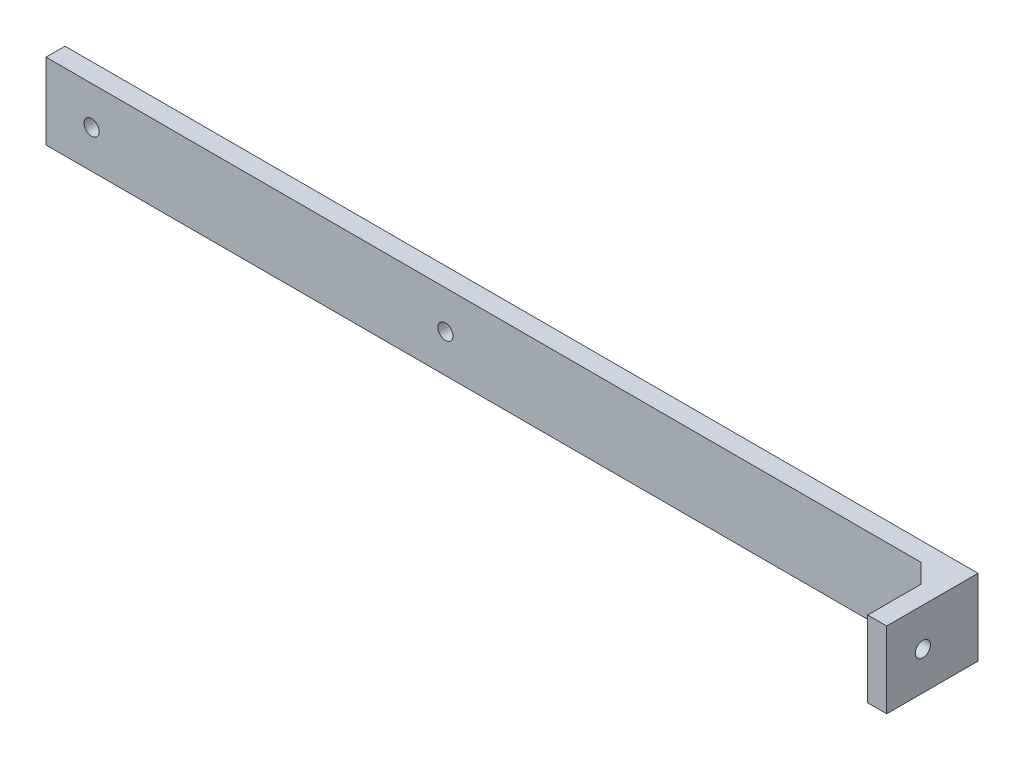
ISO-10303-21;
HEADER;
FILE_DESCRIPTION(('STEP AP214'),'2;1');
FILE_NAME('part.step','',(''),(''),'','','');
FILE_SCHEMA(('AUTOMOTIVE_DESIGN { 1 0 10303 214 1 1 1 1 }'));
ENDSEC;
DATA;
#1=APPLICATION_CONTEXT('core data for automotive mechanical design processes');
#2=APPLICATION_PROTOCOL_DEFINITION('international standard','automotive_design',2000,#1);
#3=PRODUCT_CONTEXT('',#1,'mechanical');
#4=PRODUCT('Part','Part','',(#3));
#5=PRODUCT_RELATED_PRODUCT_CATEGORY('part','',(#4));
#6=PRODUCT_DEFINITION_FORMATION('','',#4);
#7=PRODUCT_DEFINITION_CONTEXT('part definition',#1,'design');
#8=PRODUCT_DEFINITION('design','',#6,#7);
#9=PRODUCT_DEFINITION_SHAPE('','',#8);
#10=(LENGTH_UNIT() NAMED_UNIT(*) SI_UNIT(.MILLI.,.METRE.));
#11=(NAMED_UNIT(*) PLANE_ANGLE_UNIT() SI_UNIT($,.RADIAN.));
#12=(NAMED_UNIT(*) SI_UNIT($,.STERADIAN.) SOLID_ANGLE_UNIT());
#13=UNCERTAINTY_MEASURE_WITH_UNIT(LENGTH_MEASURE(1.E-05),#10,'distance_accuracy_value','');
#14=(GEOMETRIC_REPRESENTATION_CONTEXT(3) GLOBAL_UNCERTAINTY_ASSIGNED_CONTEXT((#13)) GLOBAL_UNIT_ASSIGNED_CONTEXT((#10,
#11,#12)) REPRESENTATION_CONTEXT('',''));
#15=CARTESIAN_POINT('',(0.,0.,0.));
#16=DIRECTION('',(0.,0.,1.));
#17=DIRECTION('',(1.,0.,0.));
#18=AXIS2_PLACEMENT_3D('',#15,#16,#17);
#19=CARTESIAN_POINT('',(0.,0.,5.));
#20=DIRECTION('',(0.,0.,-1.));
#21=DIRECTION('',(-1.,0.,0.));
#22=AXIS2_PLACEMENT_3D('',#19,#20,#21);
#23=PLANE('',#22);
#24=CARTESIAN_POINT('',(-15.,0.,5.));
#25=DIRECTION('',(0.,0.,-1.));
#26=DIRECTION('',(-1.,0.,0.));
#27=AXIS2_PLACEMENT_3D('',#24,#25,#26);
#28=CIRCLE('',#27,2.);
#29=CARTESIAN_POINT('',(-17.,0.,5.));
#30=VERTEX_POINT('',#29);
#31=EDGE_CURVE('E376',#30,#30,#28,.T.);
#32=ORIENTED_EDGE('',*,*,#31,.T.);
#33=EDGE_LOOP('',(#32));
#34=FACE_BOUND('',#33,.T.);
#35=CARTESIAN_POINT('',(-108.,0.,5.));
#36=DIRECTION('',(0.,0.,-1.));
#37=DIRECTION('',(-1.,0.,0.));
#38=AXIS2_PLACEMENT_3D('',#35,#36,#37);
#39=CIRCLE('',#38,2.);
#40=CARTESIAN_POINT('',(-110.,0.,5.));
#41=VERTEX_POINT('',#40);
#42=EDGE_CURVE('E380',#41,#41,#39,.T.);
#43=ORIENTED_EDGE('',*,*,#42,.T.);
#44=EDGE_LOOP('',(#43));
#45=FACE_BOUND('',#44,.T.);
#46=DIRECTION('',(1.,0.,0.));
#47=VECTOR('',#46,1.);
#48=CARTESIAN_POINT('',(110.,5.,5.));
#49=LINE('',#48,#47);
#50=CARTESIAN_POINT('',(110.,5.,5.));
#51=VERTEX_POINT('',#50);
#52=CARTESIAN_POINT('',(115.,5.,5.));
#53=VERTEX_POINT('',#52);
#54=EDGE_CURVE('E200',#51,#53,#49,.T.);
#55=ORIENTED_EDGE('',*,*,#54,.F.);
#56=DIRECTION('',(0.,-1.,0.));
#57=VECTOR('',#56,1.);
#58=CARTESIAN_POINT('',(110.,10.,5.));
#59=LINE('',#58,#57);
#60=CARTESIAN_POINT('',(110.,10.,5.));
#61=VERTEX_POINT('',#60);
#62=EDGE_CURVE('E117',#61,#51,#59,.T.);
#63=ORIENTED_EDGE('',*,*,#62,.F.);
#64=DIRECTION('',(-1.,0.,0.));
#65=VECTOR('',#64,1.);
#66=CARTESIAN_POINT('',(-120.,10.,5.));
#67=LINE('',#66,#65);
#68=CARTESIAN_POINT('',(-120.,10.,5.));
#69=VERTEX_POINT('',#68);
#70=EDGE_CURVE('E127',#61,#69,#67,.T.);
#71=ORIENTED_EDGE('',*,*,#70,.T.);
#72=DIRECTION('',(0.,-1.,0.));
#73=VECTOR('',#72,1.);
#74=CARTESIAN_POINT('',(-120.,-10.,5.));
#75=LINE('',#74,#73);
#76=CARTESIAN_POINT('',(-120.,-10.,5.));
#77=VERTEX_POINT('',#76);
#78=EDGE_CURVE('E147',#69,#77,#75,.T.);
#79=ORIENTED_EDGE('',*,*,#78,.T.);
#80=DIRECTION('',(1.,0.,0.));
#81=VECTOR('',#80,1.);
#82=CARTESIAN_POINT('',(-120.,-10.,5.));
#83=LINE('',#82,#81);
#84=CARTESIAN_POINT('',(110.,-10.,5.));
#85=VERTEX_POINT('',#84);
#86=EDGE_CURVE('E150',#77,#85,#83,.T.);
#87=ORIENTED_EDGE('',*,*,#86,.T.);
#88=DIRECTION('',(0.,-1.,0.));
#89=VECTOR('',#88,1.);
#90=CARTESIAN_POINT('',(110.,-10.,5.));
#91=LINE('',#90,#89);
#92=CARTESIAN_POINT('',(110.,-5.,5.));
#93=VERTEX_POINT('',#92);
#94=EDGE_CURVE('E202',#93,#85,#91,.T.);
#95=ORIENTED_EDGE('',*,*,#94,.F.);
#96=DIRECTION('',(1.,0.,0.));
#97=VECTOR('',#96,1.);
#98=CARTESIAN_POINT('',(110.,-5.,5.));
#99=LINE('',#98,#97);
#100=CARTESIAN_POINT('',(115.,-5.,5.));
#101=VERTEX_POINT('',#100);
#102=EDGE_CURVE('E207',#93,#101,#99,.T.);
#103=ORIENTED_EDGE('',*,*,#102,.T.);
#104=DIRECTION('',(0.,-1.,0.));
#105=VECTOR('',#104,1.);
#106=CARTESIAN_POINT('',(115.,10.,5.));
#107=LINE('',#106,#105);
#108=EDGE_CURVE('E184',#53,#101,#107,.T.);
#109=ORIENTED_EDGE('',*,*,#108,.F.);
#110=EDGE_LOOP('',(#55,#63,#71,#79,#87,#95,#103,#109));
#111=FACE_BOUND('',#110,.T.);
#112=ADVANCED_FACE('F36',(#34,#45,#111),#23,.F.);
#113=CARTESIAN_POINT('',(115.,10.,24.));
#114=DIRECTION('',(1.,0.,0.));
#115=DIRECTION('',(0.,0.,-1.));
#116=AXIS2_PLACEMENT_3D('',#113,#114,#115);
#117=PLANE('',#116);
#118=DIRECTION('',(0.,0.,-1.));
#119=VECTOR('',#118,1.);
#120=CARTESIAN_POINT('',(115.,-5.,5.));
#121=LINE('',#120,#119);
#122=CARTESIAN_POINT('',(115.,-5.,10.));
#123=VERTEX_POINT('',#122);
#124=EDGE_CURVE('E197',#123,#101,#121,.T.);
#125=ORIENTED_EDGE('',*,*,#124,.F.);
#126=DIRECTION('',(0.,1.,0.));
#127=VECTOR('',#126,1.);
#128=CARTESIAN_POINT('',(115.,-10.,10.));
#129=LINE('',#128,#127);
#130=CARTESIAN_POINT('',(115.,-10.,10.));
#131=VERTEX_POINT('',#130);
#132=EDGE_CURVE('E195',#131,#123,#129,.T.);
#133=ORIENTED_EDGE('',*,*,#132,.F.);
#134=DIRECTION('',(0.,0.,-1.));
#135=VECTOR('',#134,1.);
#136=CARTESIAN_POINT('',(115.,-10.,24.));
#137=LINE('',#136,#135);
#138=CARTESIAN_POINT('',(115.,-10.,24.));
#139=VERTEX_POINT('',#138);
#140=EDGE_CURVE('E136',#139,#131,#137,.T.);
#141=ORIENTED_EDGE('',*,*,#140,.F.);
#142=DIRECTION('',(0.,-1.,0.));
#143=VECTOR('',#142,1.);
#144=CARTESIAN_POINT('',(115.,10.,24.));
#145=LINE('',#144,#143);
#146=CARTESIAN_POINT('',(115.,10.,24.));
#147=VERTEX_POINT('',#146);
#148=EDGE_CURVE('E134',#147,#139,#145,.T.);
#149=ORIENTED_EDGE('',*,*,#148,.F.);
#150=DIRECTION('',(0.,0.,-1.));
#151=VECTOR('',#150,1.);
#152=CARTESIAN_POINT('',(115.,10.,24.));
#153=LINE('',#152,#151);
#154=CARTESIAN_POINT('',(115.,10.,10.));
#155=VERTEX_POINT('',#154);
#156=EDGE_CURVE('E124',#147,#155,#153,.T.);
#157=ORIENTED_EDGE('',*,*,#156,.T.);
#158=DIRECTION('',(0.,1.,0.));
#159=VECTOR('',#158,1.);
#160=CARTESIAN_POINT('',(115.,10.,10.));
#161=LINE('',#160,#159);
#162=CARTESIAN_POINT('',(115.,5.,10.));
#163=VERTEX_POINT('',#162);
#164=EDGE_CURVE('E112',#163,#155,#161,.T.);
#165=ORIENTED_EDGE('',*,*,#164,.F.);
#166=DIRECTION('',(0.,0.,1.));
#167=VECTOR('',#166,1.);
#168=CARTESIAN_POINT('',(115.,5.,5.));
#169=LINE('',#168,#167);
#170=EDGE_CURVE('E52',#53,#163,#169,.T.);
#171=ORIENTED_EDGE('',*,*,#170,.F.);
#172=ORIENTED_EDGE('',*,*,#108,.T.);
#173=EDGE_LOOP('',(#125,#133,#141,#149,#157,#165,#171,#172));
#174=FACE_BOUND('',#173,.T.);
#175=CARTESIAN_POINT('',(115.,0.,14.5));
#176=DIRECTION('',(1.,0.,0.));
#177=DIRECTION('',(0.,0.,-1.));
#178=AXIS2_PLACEMENT_3D('',#175,#176,#177);
#179=CIRCLE('',#178,2.);
#180=CARTESIAN_POINT('',(115.,0.,12.5));
#181=VERTEX_POINT('',#180);
#182=EDGE_CURVE('E40',#181,#181,#179,.T.);
#183=ORIENTED_EDGE('',*,*,#182,.T.);
#184=EDGE_LOOP('',(#183));
#185=FACE_BOUND('',#184,.T.);
#186=ADVANCED_FACE('F131',(#174,#185),#117,.F.);
#187=CARTESIAN_POINT('',(120.,-10.,5.));
#188=DIRECTION('',(-1.,0.,0.));
#189=DIRECTION('',(0.,0.,1.));
#190=AXIS2_PLACEMENT_3D('',#187,#188,#189);
#191=PLANE('',#190);
#192=CARTESIAN_POINT('',(120.,0.,14.5));
#193=DIRECTION('',(1.,0.,0.));
#194=DIRECTION('',(0.,0.,-1.));
#195=AXIS2_PLACEMENT_3D('',#192,#193,#194);
#196=CIRCLE('',#195,2.);
#197=CARTESIAN_POINT('',(120.,0.,12.5));
#198=VERTEX_POINT('',#197);
#199=EDGE_CURVE('E188',#198,#198,#196,.T.);
#200=ORIENTED_EDGE('',*,*,#199,.F.);
#201=EDGE_LOOP('',(#200));
#202=FACE_BOUND('',#201,.T.);
#203=DIRECTION('',(0.,1.,0.));
#204=VECTOR('',#203,1.);
#205=CARTESIAN_POINT('',(120.,-10.,0.));
#206=LINE('',#205,#204);
#207=CARTESIAN_POINT('',(120.,-10.,0.));
#208=VERTEX_POINT('',#207);
#209=CARTESIAN_POINT('',(120.,10.,0.));
#210=VERTEX_POINT('',#209);
#211=EDGE_CURVE('E135',#208,#210,#206,.T.);
#212=ORIENTED_EDGE('',*,*,#211,.T.);
#213=DIRECTION('',(0.,0.,-1.));
#214=VECTOR('',#213,1.);
#215=CARTESIAN_POINT('',(120.,10.,5.));
#216=LINE('',#215,#214);
#217=CARTESIAN_POINT('',(120.,10.,24.));
#218=VERTEX_POINT('',#217);
#219=EDGE_CURVE('E11',#218,#210,#216,.T.);
#220=ORIENTED_EDGE('',*,*,#219,.F.);
#221=DIRECTION('',(0.,1.,0.));
#222=VECTOR('',#221,1.);
#223=CARTESIAN_POINT('',(120.,10.,24.));
#224=LINE('',#223,#222);
#225=CARTESIAN_POINT('',(120.,-10.,24.));
#226=VERTEX_POINT('',#225);
#227=EDGE_CURVE('E181',#226,#218,#224,.T.);
#228=ORIENTED_EDGE('',*,*,#227,.F.);
#229=DIRECTION('',(0.,0.,-1.));
#230=VECTOR('',#229,1.);
#231=CARTESIAN_POINT('',(120.,-10.,5.));
#232=LINE('',#231,#230);
#233=EDGE_CURVE('E152',#226,#208,#232,.T.);
#234=ORIENTED_EDGE('',*,*,#233,.T.);
#235=EDGE_LOOP('',(#212,#220,#228,#234));
#236=FACE_BOUND('',#235,.T.);
#237=ADVANCED_FACE('F38',(#202,#236),#191,.F.);
#238=CARTESIAN_POINT('',(-120.,10.,5.));
#239=DIRECTION('',(0.,-1.,0.));
#240=DIRECTION('',(0.,0.,-1.));
#241=AXIS2_PLACEMENT_3D('',#238,#239,#240);
#242=PLANE('',#241);
#243=ORIENTED_EDGE('',*,*,#70,.F.);
#244=DIRECTION('',(0.707106781186548,0.,0.707106781186547));
#245=VECTOR('',#244,1.);
#246=CARTESIAN_POINT('',(110.,10.,5.));
#247=LINE('',#246,#245);
#248=EDGE_CURVE('E60',#61,#155,#247,.T.);
#249=ORIENTED_EDGE('',*,*,#248,.T.);
#250=ORIENTED_EDGE('',*,*,#156,.F.);
#251=DIRECTION('',(-1.,0.,0.));
#252=VECTOR('',#251,1.);
#253=CARTESIAN_POINT('',(120.,10.,24.));
#254=LINE('',#253,#252);
#255=EDGE_CURVE('E183',#218,#147,#254,.T.);
#256=ORIENTED_EDGE('',*,*,#255,.F.);
#257=ORIENTED_EDGE('',*,*,#219,.T.);
#258=DIRECTION('',(-1.,0.,0.));
#259=VECTOR('',#258,1.);
#260=CARTESIAN_POINT('',(-120.,10.,0.));
#261=LINE('',#260,#259);
#262=CARTESIAN_POINT('',(-120.,10.,0.));
#263=VERTEX_POINT('',#262);
#264=EDGE_CURVE('E139',#210,#263,#261,.T.);
#265=ORIENTED_EDGE('',*,*,#264,.T.);
#266=DIRECTION('',(0.,0.,-1.));
#267=VECTOR('',#266,1.);
#268=CARTESIAN_POINT('',(-120.,10.,5.));
#269=LINE('',#268,#267);
#270=EDGE_CURVE('E45',#69,#263,#269,.T.);
#271=ORIENTED_EDGE('',*,*,#270,.F.);
#272=EDGE_LOOP('',(#243,#249,#250,#256,#257,#265,#271));
#273=FACE_BOUND('',#272,.T.);
#274=ADVANCED_FACE('F122',(#273),#242,.F.);
#275=CARTESIAN_POINT('',(-120.,-10.,5.));
#276=DIRECTION('',(1.,0.,0.));
#277=DIRECTION('',(0.,0.,-1.));
#278=AXIS2_PLACEMENT_3D('',#275,#276,#277);
#279=PLANE('',#278);
#280=DIRECTION('',(0.,-1.,0.));
#281=VECTOR('',#280,1.);
#282=CARTESIAN_POINT('',(-120.,-10.,0.));
#283=LINE('',#282,#281);
#284=CARTESIAN_POINT('',(-120.,-10.,0.));
#285=VERTEX_POINT('',#284);
#286=EDGE_CURVE('E155',#263,#285,#283,.T.);
#287=ORIENTED_EDGE('',*,*,#286,.T.);
#288=DIRECTION('',(0.,0.,-1.));
#289=VECTOR('',#288,1.);
#290=CARTESIAN_POINT('',(-120.,-10.,5.));
#291=LINE('',#290,#289);
#292=EDGE_CURVE('E160',#77,#285,#291,.T.);
#293=ORIENTED_EDGE('',*,*,#292,.F.);
#294=ORIENTED_EDGE('',*,*,#78,.F.);
#295=ORIENTED_EDGE('',*,*,#270,.T.);
#296=EDGE_LOOP('',(#287,#293,#294,#295));
#297=FACE_BOUND('',#296,.T.);
#298=ADVANCED_FACE('F167',(#297),#279,.F.);
#299=CARTESIAN_POINT('',(-120.,-10.,5.));
#300=DIRECTION('',(0.,1.,0.));
#301=DIRECTION('',(0.,0.,1.));
#302=AXIS2_PLACEMENT_3D('',#299,#300,#301);
#303=PLANE('',#302);
#304=ORIENTED_EDGE('',*,*,#140,.T.);
#305=DIRECTION('',(0.707106781186548,0.,0.707106781186547));
#306=VECTOR('',#305,1.);
#307=CARTESIAN_POINT('',(110.,-10.,5.));
#308=LINE('',#307,#306);
#309=EDGE_CURVE('E128',#85,#131,#308,.T.);
#310=ORIENTED_EDGE('',*,*,#309,.F.);
#311=ORIENTED_EDGE('',*,*,#86,.F.);
#312=ORIENTED_EDGE('',*,*,#292,.T.);
#313=DIRECTION('',(1.,0.,0.));
#314=VECTOR('',#313,1.);
#315=CARTESIAN_POINT('',(-120.,-10.,0.));
#316=LINE('',#315,#314);
#317=EDGE_CURVE('E148',#285,#208,#316,.T.);
#318=ORIENTED_EDGE('',*,*,#317,.T.);
#319=ORIENTED_EDGE('',*,*,#233,.F.);
#320=DIRECTION('',(1.,0.,0.));
#321=VECTOR('',#320,1.);
#322=CARTESIAN_POINT('',(120.,-10.,24.));
#323=LINE('',#322,#321);
#324=EDGE_CURVE('E142',#139,#226,#323,.T.);
#325=ORIENTED_EDGE('',*,*,#324,.F.);
#326=EDGE_LOOP('',(#304,#310,#311,#312,#318,#319,#325));
#327=FACE_BOUND('',#326,.T.);
#328=ADVANCED_FACE('F174',(#327),#303,.F.);
#329=CARTESIAN_POINT('',(0.,0.,0.));
#330=DIRECTION('',(0.,0.,-1.));
#331=DIRECTION('',(-1.,0.,0.));
#332=AXIS2_PLACEMENT_3D('',#329,#330,#331);
#333=PLANE('',#332);
#334=CARTESIAN_POINT('',(-15.,0.,0.));
#335=DIRECTION('',(0.,0.,-1.));
#336=DIRECTION('',(-1.,0.,0.));
#337=AXIS2_PLACEMENT_3D('',#334,#335,#336);
#338=CIRCLE('',#337,2.);
#339=CARTESIAN_POINT('',(-17.,0.,0.));
#340=VERTEX_POINT('',#339);
#341=EDGE_CURVE('E374',#340,#340,#338,.T.);
#342=ORIENTED_EDGE('',*,*,#341,.F.);
#343=EDGE_LOOP('',(#342));
#344=FACE_BOUND('',#343,.T.);
#345=CARTESIAN_POINT('',(-108.,0.,0.));
#346=DIRECTION('',(0.,0.,-1.));
#347=DIRECTION('',(-1.,0.,0.));
#348=AXIS2_PLACEMENT_3D('',#345,#346,#347);
#349=CIRCLE('',#348,2.);
#350=CARTESIAN_POINT('',(-110.,0.,0.));
#351=VERTEX_POINT('',#350);
#352=EDGE_CURVE('E377',#351,#351,#349,.T.);
#353=ORIENTED_EDGE('',*,*,#352,.F.);
#354=EDGE_LOOP('',(#353));
#355=FACE_BOUND('',#354,.T.);
#356=ORIENTED_EDGE('',*,*,#211,.F.);
#357=ORIENTED_EDGE('',*,*,#317,.F.);
#358=ORIENTED_EDGE('',*,*,#286,.F.);
#359=ORIENTED_EDGE('',*,*,#264,.F.);
#360=EDGE_LOOP('',(#356,#357,#358,#359));
#361=FACE_BOUND('',#360,.T.);
#362=ADVANCED_FACE('F172',(#344,#355,#361),#333,.T.);
#363=CARTESIAN_POINT('',(0.,0.,24.));
#364=DIRECTION('',(0.,0.,-1.));
#365=DIRECTION('',(-1.,0.,0.));
#366=AXIS2_PLACEMENT_3D('',#363,#364,#365);
#367=PLANE('',#366);
#368=ORIENTED_EDGE('',*,*,#227,.T.);
#369=ORIENTED_EDGE('',*,*,#255,.T.);
#370=ORIENTED_EDGE('',*,*,#148,.T.);
#371=ORIENTED_EDGE('',*,*,#324,.T.);
#372=EDGE_LOOP('',(#368,#369,#370,#371));
#373=FACE_BOUND('',#372,.T.);
#374=ADVANCED_FACE('F192',(#373),#367,.F.);
#375=CARTESIAN_POINT('',(-120.,0.,14.5));
#376=DIRECTION('',(1.,0.,0.));
#377=DIRECTION('',(0.,0.,-1.));
#378=AXIS2_PLACEMENT_3D('',#375,#376,#377);
#379=CYLINDRICAL_SURFACE('',#378,2.);
#380=ORIENTED_EDGE('',*,*,#199,.T.);
#381=EDGE_LOOP('',(#380));
#382=FACE_BOUND('',#381,.T.);
#383=ORIENTED_EDGE('',*,*,#182,.F.);
#384=EDGE_LOOP('',(#383));
#385=FACE_BOUND('',#384,.T.);
#386=ADVANCED_FACE('F232',(#382,#385),#379,.F.);
#387=CARTESIAN_POINT('',(110.,-5.,5.));
#388=DIRECTION('',(0.,-1.,0.));
#389=DIRECTION('',(0.,0.,-1.));
#390=AXIS2_PLACEMENT_3D('',#387,#388,#389);
#391=PLANE('',#390);
#392=ORIENTED_EDGE('',*,*,#102,.F.);
#393=DIRECTION('',(0.707106781186548,0.,0.707106781186547));
#394=VECTOR('',#393,1.);
#395=CARTESIAN_POINT('',(110.,-5.,5.));
#396=LINE('',#395,#394);
#397=EDGE_CURVE('E214',#93,#123,#396,.T.);
#398=ORIENTED_EDGE('',*,*,#397,.T.);
#399=ORIENTED_EDGE('',*,*,#124,.T.);
#400=EDGE_LOOP('',(#392,#398,#399));
#401=FACE_BOUND('',#400,.T.);
#402=ADVANCED_FACE('F217',(#401),#391,.F.);
#403=CARTESIAN_POINT('',(110.,5.,5.));
#404=DIRECTION('',(0.,1.,0.));
#405=DIRECTION('',(0.,0.,1.));
#406=AXIS2_PLACEMENT_3D('',#403,#404,#405);
#407=PLANE('',#406);
#408=ORIENTED_EDGE('',*,*,#170,.T.);
#409=DIRECTION('',(-0.707106781186548,0.,-0.707106781186547));
#410=VECTOR('',#409,1.);
#411=CARTESIAN_POINT('',(110.,5.,5.));
#412=LINE('',#411,#410);
#413=EDGE_CURVE('E115',#163,#51,#412,.T.);
#414=ORIENTED_EDGE('',*,*,#413,.T.);
#415=ORIENTED_EDGE('',*,*,#54,.T.);
#416=EDGE_LOOP('',(#408,#414,#415));
#417=FACE_BOUND('',#416,.T.);
#418=ADVANCED_FACE('F224',(#417),#407,.F.);
#419=CARTESIAN_POINT('',(110.,10.,5.));
#420=DIRECTION('',(0.707106781186547,0.,-0.707106781186548));
#421=DIRECTION('',(-0.707106781186548,0.,-0.707106781186547));
#422=AXIS2_PLACEMENT_3D('',#419,#420,#421);
#423=PLANE('',#422);
#424=ORIENTED_EDGE('',*,*,#164,.T.);
#425=ORIENTED_EDGE('',*,*,#248,.F.);
#426=ORIENTED_EDGE('',*,*,#62,.T.);
#427=ORIENTED_EDGE('',*,*,#413,.F.);
#428=EDGE_LOOP('',(#424,#425,#426,#427));
#429=FACE_BOUND('',#428,.T.);
#430=ADVANCED_FACE('F113',(#429),#423,.F.);
#431=ORIENTED_EDGE('',*,*,#94,.T.);
#432=ORIENTED_EDGE('',*,*,#309,.T.);
#433=ORIENTED_EDGE('',*,*,#132,.T.);
#434=ORIENTED_EDGE('',*,*,#397,.F.);
#435=EDGE_LOOP('',(#431,#432,#433,#434));
#436=FACE_BOUND('',#435,.T.);
#437=ADVANCED_FACE('F213',(#436),#423,.F.);
#438=CARTESIAN_POINT('',(-108.,0.,24.));
#439=DIRECTION('',(0.,0.,-1.));
#440=DIRECTION('',(-1.,0.,0.));
#441=AXIS2_PLACEMENT_3D('',#438,#439,#440);
#442=CYLINDRICAL_SURFACE('',#441,2.);
#443=ORIENTED_EDGE('',*,*,#352,.T.);
#444=EDGE_LOOP('',(#443));
#445=FACE_BOUND('',#444,.T.);
#446=ORIENTED_EDGE('',*,*,#42,.F.);
#447=EDGE_LOOP('',(#446));
#448=FACE_BOUND('',#447,.T.);
#449=ADVANCED_FACE('F351',(#445,#448),#442,.F.);
#450=CARTESIAN_POINT('',(-15.,0.,10.));
#451=DIRECTION('',(0.,0.,-1.));
#452=DIRECTION('',(-1.,0.,0.));
#453=AXIS2_PLACEMENT_3D('',#450,#451,#452);
#454=CYLINDRICAL_SURFACE('',#453,2.);
#455=ORIENTED_EDGE('',*,*,#341,.T.);
#456=EDGE_LOOP('',(#455));
#457=FACE_BOUND('',#456,.T.);
#458=ORIENTED_EDGE('',*,*,#31,.F.);
#459=EDGE_LOOP('',(#458));
#460=FACE_BOUND('',#459,.T.);
#461=ADVANCED_FACE('F357',(#457,#460),#454,.F.);
#462=CLOSED_SHELL('',(#112,#186,#237,#274,#298,#328,#362,#374,#386,#402,#418,#430,#437,#449,#461));
#463=MANIFOLD_SOLID_BREP('B2',#462);
#464=ADVANCED_BREP_SHAPE_REPRESENTATION('',(#18,#463),#14);
#465=SHAPE_DEFINITION_REPRESENTATION(#9,#464);
ENDSEC;
END-ISO-10303-21;
